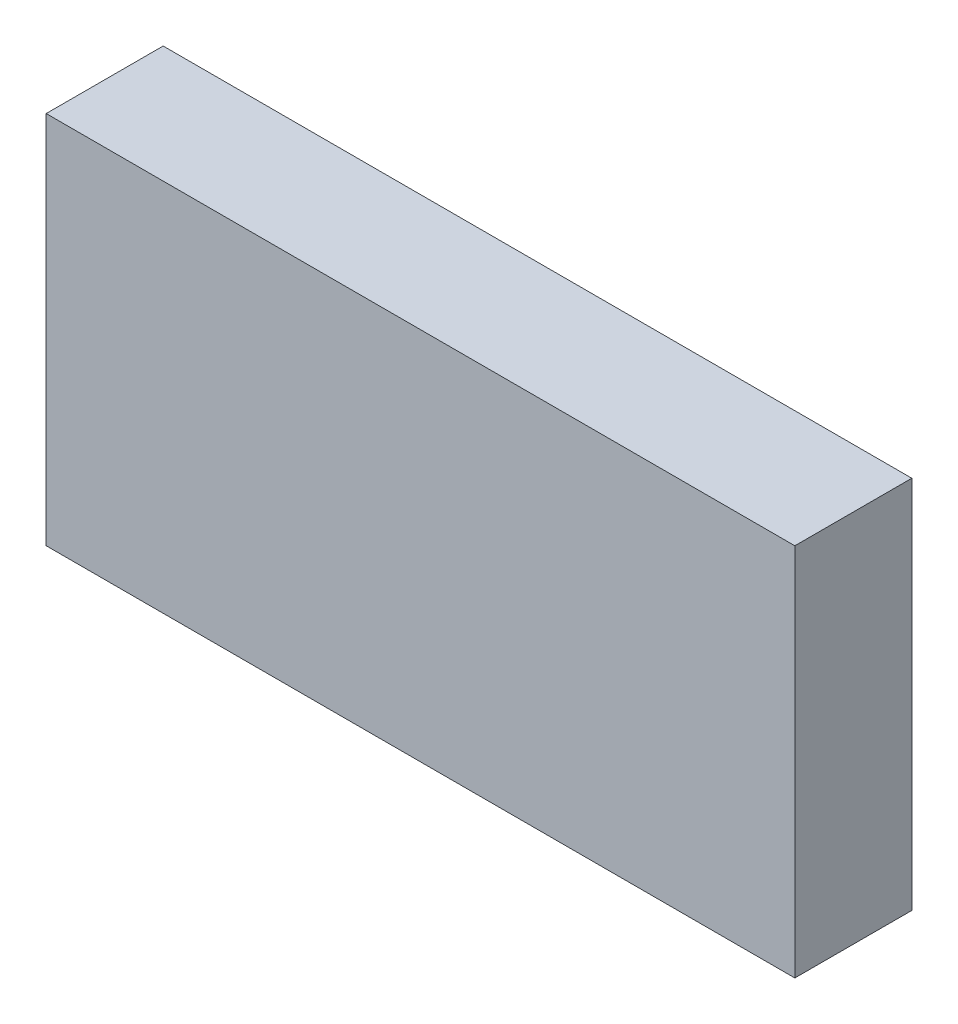
ISO-10303-21;
HEADER;
FILE_DESCRIPTION(('STEP AP214'),'2;1');
FILE_NAME('part.step','',(''),(''),'','','');
FILE_SCHEMA(('AUTOMOTIVE_DESIGN { 1 0 10303 214 1 1 1 1 }'));
ENDSEC;
DATA;
#1=APPLICATION_CONTEXT('core data for automotive mechanical design processes');
#2=APPLICATION_PROTOCOL_DEFINITION('international standard','automotive_design',2000,#1);
#3=PRODUCT_CONTEXT('',#1,'mechanical');
#4=PRODUCT('Part','Part','',(#3));
#5=PRODUCT_RELATED_PRODUCT_CATEGORY('part','',(#4));
#6=PRODUCT_DEFINITION_FORMATION('','',#4);
#7=PRODUCT_DEFINITION_CONTEXT('part definition',#1,'design');
#8=PRODUCT_DEFINITION('design','',#6,#7);
#9=PRODUCT_DEFINITION_SHAPE('','',#8);
#10=(LENGTH_UNIT() NAMED_UNIT(*) SI_UNIT(.MILLI.,.METRE.));
#11=(NAMED_UNIT(*) PLANE_ANGLE_UNIT() SI_UNIT($,.RADIAN.));
#12=(NAMED_UNIT(*) SI_UNIT($,.STERADIAN.) SOLID_ANGLE_UNIT());
#13=UNCERTAINTY_MEASURE_WITH_UNIT(LENGTH_MEASURE(1.E-05),#10,'distance_accuracy_value','');
#14=(GEOMETRIC_REPRESENTATION_CONTEXT(3) GLOBAL_UNCERTAINTY_ASSIGNED_CONTEXT((#13)) GLOBAL_UNIT_ASSIGNED_CONTEXT((#10,
#11,#12)) REPRESENTATION_CONTEXT('',''));
#15=CARTESIAN_POINT('',(0.,0.,0.));
#16=DIRECTION('',(0.,0.,1.));
#17=DIRECTION('',(1.,0.,0.));
#18=AXIS2_PLACEMENT_3D('',#15,#16,#17);
#19=CARTESIAN_POINT('',(-1.59999934,0.80000094,0.5));
#20=DIRECTION('',(0.,0.,-1.));
#21=DIRECTION('',(-1.,0.,0.));
#22=AXIS2_PLACEMENT_3D('',#19,#20,#21);
#23=PLANE('',#22);
#24=DIRECTION('',(1.,0.,0.));
#25=VECTOR('',#24,1.);
#26=CARTESIAN_POINT('',(-1.59999934,-0.7999984,0.5));
#27=LINE('',#26,#25);
#28=CARTESIAN_POINT('',(-1.59999934,-0.7999984,0.5));
#29=VERTEX_POINT('',#28);
#30=CARTESIAN_POINT('',(1.60000188,-0.7999984,0.5));
#31=VERTEX_POINT('',#30);
#32=EDGE_CURVE('E55',#29,#31,#27,.T.);
#33=ORIENTED_EDGE('',*,*,#32,.T.);
#34=DIRECTION('',(0.,1.,0.));
#35=VECTOR('',#34,1.);
#36=CARTESIAN_POINT('',(1.60000188,-0.7999984,0.5));
#37=LINE('',#36,#35);
#38=CARTESIAN_POINT('',(1.60000188,0.80000094,0.5));
#39=VERTEX_POINT('',#38);
#40=EDGE_CURVE('E58',#31,#39,#37,.T.);
#41=ORIENTED_EDGE('',*,*,#40,.T.);
#42=DIRECTION('',(1.,0.,0.));
#43=VECTOR('',#42,1.);
#44=CARTESIAN_POINT('',(1.60000188,0.80000094,0.5));
#45=LINE('',#44,#43);
#46=CARTESIAN_POINT('',(-1.59999934,0.80000094,0.5));
#47=VERTEX_POINT('',#46);
#48=EDGE_CURVE('E60',#39,#47,#45,.F.);
#49=ORIENTED_EDGE('',*,*,#48,.T.);
#50=DIRECTION('',(0.,1.,0.));
#51=VECTOR('',#50,1.);
#52=CARTESIAN_POINT('',(-1.59999934,0.80000094,0.5));
#53=LINE('',#52,#51);
#54=EDGE_CURVE('E20',#29,#47,#53,.T.);
#55=ORIENTED_EDGE('',*,*,#54,.F.);
#56=EDGE_LOOP('',(#33,#41,#49,#55));
#57=FACE_BOUND('',#56,.T.);
#58=ADVANCED_FACE('F17',(#57),#23,.F.);
#59=CARTESIAN_POINT('',(1.60000188,0.80000094,0.));
#60=DIRECTION('',(0.,-1.,0.));
#61=DIRECTION('',(0.,0.,-1.));
#62=AXIS2_PLACEMENT_3D('',#59,#60,#61);
#63=PLANE('',#62);
#64=DIRECTION('',(0.,0.,-1.));
#65=VECTOR('',#64,1.);
#66=CARTESIAN_POINT('',(-1.59999934,0.80000094,0.));
#67=LINE('',#66,#65);
#68=CARTESIAN_POINT('',(-1.59999934,0.80000094,0.));
#69=VERTEX_POINT('',#68);
#70=EDGE_CURVE('E71',#69,#47,#67,.F.);
#71=ORIENTED_EDGE('',*,*,#70,.T.);
#72=ORIENTED_EDGE('',*,*,#48,.F.);
#73=DIRECTION('',(0.,0.,1.));
#74=VECTOR('',#73,1.);
#75=CARTESIAN_POINT('',(1.60000188,0.80000094,0.));
#76=LINE('',#75,#74);
#77=CARTESIAN_POINT('',(1.60000188,0.80000094,0.));
#78=VERTEX_POINT('',#77);
#79=EDGE_CURVE('E65',#39,#78,#76,.F.);
#80=ORIENTED_EDGE('',*,*,#79,.T.);
#81=DIRECTION('',(-1.,0.,0.));
#82=VECTOR('',#81,1.);
#83=CARTESIAN_POINT('',(-1.59999934,0.80000094,0.));
#84=LINE('',#83,#82);
#85=EDGE_CURVE('E83',#69,#78,#84,.F.);
#86=ORIENTED_EDGE('',*,*,#85,.F.);
#87=EDGE_LOOP('',(#71,#72,#80,#86));
#88=FACE_BOUND('',#87,.T.);
#89=ADVANCED_FACE('F68',(#88),#63,.F.);
#90=CARTESIAN_POINT('',(1.60000188,-0.7999984,0.));
#91=DIRECTION('',(-1.,0.,0.));
#92=DIRECTION('',(0.,0.,1.));
#93=AXIS2_PLACEMENT_3D('',#90,#91,#92);
#94=PLANE('',#93);
#95=ORIENTED_EDGE('',*,*,#79,.F.);
#96=ORIENTED_EDGE('',*,*,#40,.F.);
#97=DIRECTION('',(0.,0.,1.));
#98=VECTOR('',#97,1.);
#99=CARTESIAN_POINT('',(1.60000188,-0.7999984,0.));
#100=LINE('',#99,#98);
#101=CARTESIAN_POINT('',(1.60000188,-0.7999984,0.));
#102=VERTEX_POINT('',#101);
#103=EDGE_CURVE('E77',#31,#102,#100,.F.);
#104=ORIENTED_EDGE('',*,*,#103,.T.);
#105=DIRECTION('',(0.,1.,0.));
#106=VECTOR('',#105,1.);
#107=CARTESIAN_POINT('',(1.60000188,0.80000094,0.));
#108=LINE('',#107,#106);
#109=EDGE_CURVE('E74',#78,#102,#108,.F.);
#110=ORIENTED_EDGE('',*,*,#109,.F.);
#111=EDGE_LOOP('',(#95,#96,#104,#110));
#112=FACE_BOUND('',#111,.T.);
#113=ADVANCED_FACE('F72',(#112),#94,.F.);
#114=CARTESIAN_POINT('',(-1.59999934,-0.7999984,0.));
#115=DIRECTION('',(0.,1.,0.));
#116=DIRECTION('',(0.,0.,1.));
#117=AXIS2_PLACEMENT_3D('',#114,#115,#116);
#118=PLANE('',#117);
#119=ORIENTED_EDGE('',*,*,#103,.F.);
#120=ORIENTED_EDGE('',*,*,#32,.F.);
#121=DIRECTION('',(0.,0.,-1.));
#122=VECTOR('',#121,1.);
#123=CARTESIAN_POINT('',(-1.59999934,-0.7999984,0.));
#124=LINE('',#123,#122);
#125=CARTESIAN_POINT('',(-1.59999934,-0.7999984,0.));
#126=VERTEX_POINT('',#125);
#127=EDGE_CURVE('E35',#29,#126,#124,.T.);
#128=ORIENTED_EDGE('',*,*,#127,.T.);
#129=DIRECTION('',(-1.,0.,0.));
#130=VECTOR('',#129,1.);
#131=CARTESIAN_POINT('',(-1.59999934,-0.7999984,0.));
#132=LINE('',#131,#130);
#133=EDGE_CURVE('E26',#102,#126,#132,.T.);
#134=ORIENTED_EDGE('',*,*,#133,.F.);
#135=EDGE_LOOP('',(#119,#120,#128,#134));
#136=FACE_BOUND('',#135,.T.);
#137=ADVANCED_FACE('F89',(#136),#118,.F.);
#138=CARTESIAN_POINT('',(-1.59999934,0.80000094,0.));
#139=DIRECTION('',(1.,0.,0.));
#140=DIRECTION('',(0.,0.,-1.));
#141=AXIS2_PLACEMENT_3D('',#138,#139,#140);
#142=PLANE('',#141);
#143=ORIENTED_EDGE('',*,*,#127,.F.);
#144=ORIENTED_EDGE('',*,*,#54,.T.);
#145=ORIENTED_EDGE('',*,*,#70,.F.);
#146=DIRECTION('',(0.,1.,0.));
#147=VECTOR('',#146,1.);
#148=CARTESIAN_POINT('',(-1.59999934,0.80000094,0.));
#149=LINE('',#148,#147);
#150=EDGE_CURVE('E11',#126,#69,#149,.T.);
#151=ORIENTED_EDGE('',*,*,#150,.F.);
#152=EDGE_LOOP('',(#143,#144,#145,#151));
#153=FACE_BOUND('',#152,.T.);
#154=ADVANCED_FACE('F91',(#153),#142,.F.);
#155=CARTESIAN_POINT('',(-1.59999934,0.80000094,0.));
#156=DIRECTION('',(0.,0.,-1.));
#157=DIRECTION('',(-1.,0.,0.));
#158=AXIS2_PLACEMENT_3D('',#155,#156,#157);
#159=PLANE('',#158);
#160=ORIENTED_EDGE('',*,*,#133,.T.);
#161=ORIENTED_EDGE('',*,*,#150,.T.);
#162=ORIENTED_EDGE('',*,*,#85,.T.);
#163=ORIENTED_EDGE('',*,*,#109,.T.);
#164=EDGE_LOOP('',(#160,#161,#162,#163));
#165=FACE_BOUND('',#164,.T.);
#166=ADVANCED_FACE('F88',(#165),#159,.T.);
#167=CLOSED_SHELL('',(#58,#89,#113,#137,#154,#166));
#168=MANIFOLD_SOLID_BREP('B1',#167);
#169=ADVANCED_BREP_SHAPE_REPRESENTATION('',(#18,#168),#14);
#170=SHAPE_DEFINITION_REPRESENTATION(#9,#169);
ENDSEC;
END-ISO-10303-21;
